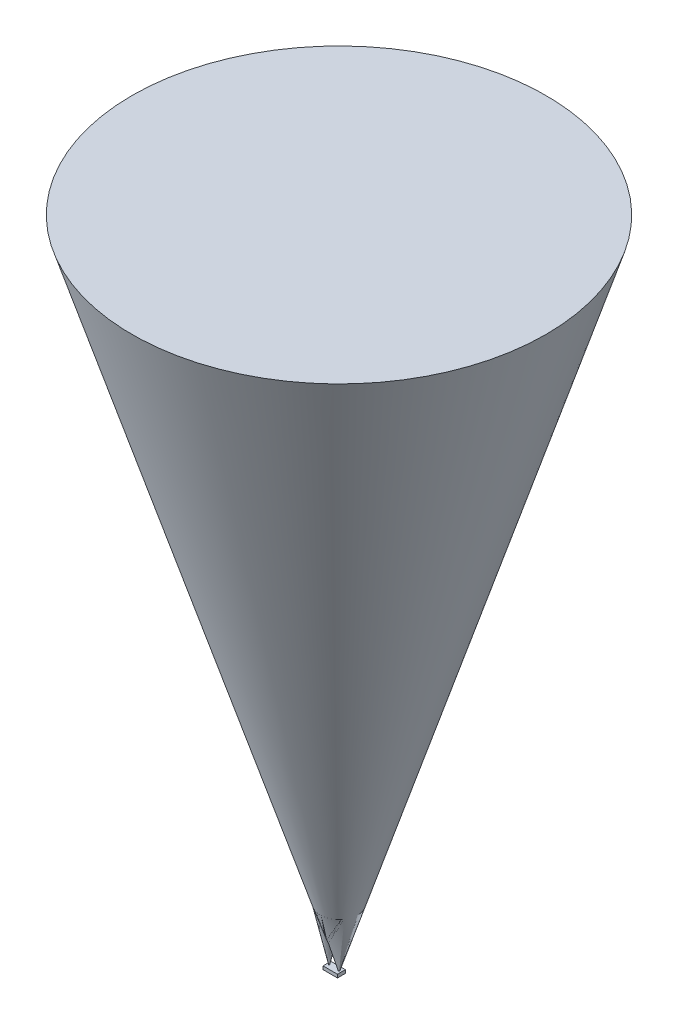
ISO-10303-21;
HEADER;
FILE_DESCRIPTION(('STEP AP214'),'2;1');
FILE_NAME('part.step','',(''),(''),'','','');
FILE_SCHEMA(('AUTOMOTIVE_DESIGN { 1 0 10303 214 1 1 1 1 }'));
ENDSEC;
DATA;
#1=APPLICATION_CONTEXT('core data for automotive mechanical design processes');
#2=APPLICATION_PROTOCOL_DEFINITION('international standard','automotive_design',2000,#1);
#3=PRODUCT_CONTEXT('',#1,'mechanical');
#4=PRODUCT('Part','Part','',(#3));
#5=PRODUCT_RELATED_PRODUCT_CATEGORY('part','',(#4));
#6=PRODUCT_DEFINITION_FORMATION('','',#4);
#7=PRODUCT_DEFINITION_CONTEXT('part definition',#1,'design');
#8=PRODUCT_DEFINITION('design','',#6,#7);
#9=PRODUCT_DEFINITION_SHAPE('','',#8);
#10=(LENGTH_UNIT() NAMED_UNIT(*) SI_UNIT(.MILLI.,.METRE.));
#11=(NAMED_UNIT(*) PLANE_ANGLE_UNIT() SI_UNIT($,.RADIAN.));
#12=(NAMED_UNIT(*) SI_UNIT($,.STERADIAN.) SOLID_ANGLE_UNIT());
#13=UNCERTAINTY_MEASURE_WITH_UNIT(LENGTH_MEASURE(1.E-05),#10,'distance_accuracy_value','');
#14=(GEOMETRIC_REPRESENTATION_CONTEXT(3) GLOBAL_UNCERTAINTY_ASSIGNED_CONTEXT((#13)) GLOBAL_UNIT_ASSIGNED_CONTEXT((#10,
#11,#12)) REPRESENTATION_CONTEXT('',''));
#15=CARTESIAN_POINT('',(0.,0.,0.));
#16=DIRECTION('',(0.,0.,1.));
#17=DIRECTION('',(1.,0.,0.));
#18=AXIS2_PLACEMENT_3D('',#15,#16,#17);
#19=CARTESIAN_POINT('',(-1.535,200.548929149634,0.));
#20=DIRECTION('',(0.,1.,0.));
#21=DIRECTION('',(0.,0.,1.));
#22=AXIS2_PLACEMENT_3D('',#19,#20,#21);
#23=PLANE('',#22);
#24=CARTESIAN_POINT('',(1.465,200.548929149634,0.));
#25=DIRECTION('',(0.,-1.,0.));
#26=DIRECTION('',(1.,0.,0.));
#27=AXIS2_PLACEMENT_3D('',#24,#25,#26);
#28=CIRCLE('',#27,63.117535682977);
#29=CARTESIAN_POINT('',(64.582535682977,200.548929149634,0.));
#30=VERTEX_POINT('',#29);
#31=EDGE_CURVE('E54',#30,#30,#28,.T.);
#32=ORIENTED_EDGE('',*,*,#31,.F.);
#33=EDGE_LOOP('',(#32));
#34=FACE_BOUND('',#33,.T.);
#35=ADVANCED_FACE('F43',(#34),#23,.T.);
#36=CARTESIAN_POINT('',(1.465,0.365681039527352,0.));
#37=DIRECTION('',(0.,1.,0.));
#38=DIRECTION('',(-1.,0.,0.));
#39=AXIS2_PLACEMENT_3D('',#36,#37,#38);
#40=CONICAL_SURFACE('',#39,0.,0.305432619099005);
#41=CARTESIAN_POINT('',(-8.50344210311053,31.9815402014116,0.));
#42=CARTESIAN_POINT('',(-8.50343353833006,31.981524732879,0.118857201583902));
#43=CARTESIAN_POINT('',(-8.49817121478473,31.9716507032928,0.237867029165868));
#44=CARTESIAN_POINT('',(-8.47768877357461,31.9331660366186,0.472012023839944));
#45=CARTESIAN_POINT('',(-8.46244752521837,31.9045156398503,0.587138422457629));
#46=CARTESIAN_POINT('',(-8.42367343589052,31.8314690826656,0.809553507505115));
#47=CARTESIAN_POINT('',(-8.40021309086815,31.7872105706222,0.916901125284098));
#48=CARTESIAN_POINT('',(-8.34670280067096,31.6859845009529,1.12351023837832));
#49=CARTESIAN_POINT('',(-8.31665214709803,31.6290155770621,1.22277086284113));
#50=CARTESIAN_POINT('',(-8.22742276674123,31.4593033314844,1.48344077889626));
#51=CARTESIAN_POINT('',(-8.1631406836987,31.3364751046561,1.63650882966374));
#52=CARTESIAN_POINT('',(-8.02538236323271,31.0714048718875,1.92012728675832));
#53=CARTESIAN_POINT('',(-7.95187483579721,30.9290966389491,2.05059728156288));
#54=CARTESIAN_POINT('',(-7.80568367047086,30.6439022803988,2.28230867641868));
#55=CARTESIAN_POINT('',(-7.73342206756682,30.5020104741413,2.38506625256794));
#56=CARTESIAN_POINT('',(-7.5860511964929,30.2104721029121,2.57673893351637));
#57=CARTESIAN_POINT('',(-7.51093949725936,30.0608188758322,2.66564187488177));
#58=CARTESIAN_POINT('',(-7.35896281818631,29.7556377825309,2.83164939420538));
#59=CARTESIAN_POINT('',(-7.2820950788074,29.6001003761228,2.90873369004084));
#60=CARTESIAN_POINT('',(-7.12753823712475,29.284795121319,3.05251018453797));
#61=CARTESIAN_POINT('',(-7.04984936323734,29.1250284317046,3.11920519597633));
#62=CARTESIAN_POINT('',(-6.88889611773646,28.7912102272249,3.2477393425061));
#63=CARTESIAN_POINT('',(-6.8056111692431,28.6169250973151,3.30894177067445));
#64=CARTESIAN_POINT('',(-6.6391699789398,28.2653422173134,3.4222706350648));
#65=CARTESIAN_POINT('',(-6.55601377001605,28.0880438033148,3.47439504194089));
#66=CARTESIAN_POINT('',(-6.39012710228885,27.7309125433886,3.57061098143731));
#67=CARTESIAN_POINT('',(-6.3073970418821,27.5510777649867,3.6146959880028));
#68=CARTESIAN_POINT('',(-6.14268293671001,27.1894368755594,3.69561695529915));
#69=CARTESIAN_POINT('',(-6.06069898264571,27.0076305305943,3.73245204562482));
#70=CARTESIAN_POINT('',(-5.81588458174825,26.4591173880919,3.83327283993961));
#71=CARTESIAN_POINT('',(-5.65448195300937,26.0899408213718,3.8874116764043));
#72=CARTESIAN_POINT('',(-5.33673464364037,25.347175031261,3.97380285265533));
#73=CARTESIAN_POINT('',(-5.18038805822051,24.9735875437678,4.00606352838827));
#74=CARTESIAN_POINT('',(-4.85930427599547,24.188574443757,4.05404420172993));
#75=CARTESIAN_POINT('',(-4.69511145239452,23.7768191567537,4.06797714935639));
#76=CARTESIAN_POINT('',(-4.37410525159036,22.9501882365656,4.07681079903725));
#77=CARTESIAN_POINT('',(-4.21729347773191,22.5353119479161,4.07170738507181));
#78=CARTESIAN_POINT('',(-3.91137003556743,21.7028269078403,4.04490795370185));
#79=CARTESIAN_POINT('',(-3.7622660421058,21.2852158822909,4.02319572572171));
#80=CARTESIAN_POINT('',(-3.47225218073109,20.4482245305874,3.96512784946486));
#81=CARTESIAN_POINT('',(-3.33134172439667,20.0288443338127,3.92877325422417));
#82=CARTESIAN_POINT('',(-3.05775983013202,19.1881373726247,3.84295051742471));
#83=CARTESIAN_POINT('',(-2.92509948698717,18.7668087720323,3.79346516900118));
#84=CARTESIAN_POINT('',(-2.66839912300766,17.9230758553103,3.68269211235594));
#85=CARTESIAN_POINT('',(-2.54435933488799,17.5006715104593,3.62140408568495));
#86=CARTESIAN_POINT('',(-2.30511894192223,16.655340662573,3.48809695125221));
#87=CARTESIAN_POINT('',(-2.18991307505369,16.232414625273,3.4160843081401));
#88=CARTESIAN_POINT('',(-1.96837849816342,15.3860807967842,3.26208367781385));
#89=CARTESIAN_POINT('',(-1.86204938294829,14.9626730284801,3.18009614633958));
#90=CARTESIAN_POINT('',(-1.64592789087336,14.0639554685839,2.99606426683372));
#91=CARTESIAN_POINT('',(-1.53729639989258,13.5886174638926,2.89279328785673));
#92=CARTESIAN_POINT('',(-1.33142424918579,12.6380938203264,2.67450197116632));
#93=CARTESIAN_POINT('',(-1.2341850028972,12.1629082076372,2.55948017883495));
#94=CARTESIAN_POINT('',(-1.09710917568128,11.4516087905772,2.37769262149852));
#95=CARTESIAN_POINT('',(-1.05294067476709,11.2151085198468,2.31565407532045));
#96=CARTESIAN_POINT('',(-0.967483610764037,10.742510240318,2.18816302633699));
#97=CARTESIAN_POINT('',(-0.92619497233033,10.5064122211534,2.12271061292579));
#98=CARTESIAN_POINT('',(-0.846529383132704,10.0349033002431,1.98795579367916));
#99=CARTESIAN_POINT('',(-0.808151542175948,9.79949220976763,1.91865457622457));
#100=CARTESIAN_POINT('',(-0.734323348216769,9.3296316666,1.7754158518257));
#101=CARTESIAN_POINT('',(-0.698872772772225,9.09518214212776,1.70147869791755));
#102=CARTESIAN_POINT('',(-0.643560029249029,8.71463279661656,1.57614152311155));
#103=CARTESIAN_POINT('',(-0.622798612895502,8.56806182970487,1.5265708739446));
#104=CARTESIAN_POINT('',(-0.582465507010859,8.27575873440817,1.4244315596009));
#105=CARTESIAN_POINT('',(-0.56289410848722,8.13002681903004,1.37186216715308));
#106=CARTESIAN_POINT('',(-0.524903783565857,7.83927229688415,1.26263023440985));
#107=CARTESIAN_POINT('',(-0.506489670913944,7.69425470333636,1.20595246998954));
#108=CARTESIAN_POINT('',(-0.479850476486562,7.47834422054129,1.11683144012364));
#109=CARTESIAN_POINT('',(-0.47113652673444,7.40666164309136,1.08644872466423));
#110=CARTESIAN_POINT('',(-0.454048693539378,7.26399873363279,1.02399140671901));
#111=CARTESIAN_POINT('',(-0.445674783908262,7.19301834786456,0.991916934962793));
#112=CARTESIAN_POINT('',(-0.429233773967533,7.05154453884788,0.925424980168036));
#113=CARTESIAN_POINT('',(-0.42116905868738,6.9810574054972,0.890993451952127));
#114=CARTESIAN_POINT('',(-0.405432224460889,6.84138809266155,0.819284668070515));
#115=CARTESIAN_POINT('',(-0.397760520406583,6.7722073390126,0.782004504532244));
#116=CARTESIAN_POINT('',(-0.382928245428266,6.63638339874704,0.703833967780044));
#117=CARTESIAN_POINT('',(-0.37576497327164,6.56972784312155,0.662965737498744));
#118=CARTESIAN_POINT('',(-0.362033594602776,6.44001236138564,0.575849983117886));
#119=CARTESIAN_POINT('',(-0.355464183317993,6.37694467134788,0.529614788240454));
#120=CARTESIAN_POINT('',(-0.345992194795261,6.28473818377523,0.451586571509095));
#121=CARTESIAN_POINT('',(-0.342776363473133,6.25316880548007,0.422735752685277));
#122=CARTESIAN_POINT('',(-0.336720163205177,6.19329059524265,0.361718317812212));
#123=CARTESIAN_POINT('',(-0.333879524084467,6.1649794189892,0.329554117756525));
#124=CARTESIAN_POINT('',(-0.329544371989592,6.12151573882393,0.271433483106739));
#125=CARTESIAN_POINT('',(-0.32790261353035,6.10497361460397,0.246543187391566));
#126=CARTESIAN_POINT('',(-0.325009811195627,6.07572923492793,0.194561612103664));
#127=CARTESIAN_POINT('',(-0.323757988625783,6.06301932825669,0.167474857013355));
#128=CARTESIAN_POINT('',(-0.322013593972999,6.04527261251962,0.117862893885106));
#129=CARTESIAN_POINT('',(-0.32141218448089,6.03913905216883,0.0957404514773157));
#130=CARTESIAN_POINT('',(-0.320582121659048,6.03066826521567,0.0507783211182011));
#131=CARTESIAN_POINT('',(-0.32035297521975,6.02832601655572,0.02793962290676));
#132=CARTESIAN_POINT('',(-0.320294456290532,6.02772813495327,-0.0178470009183164));
#133=CARTESIAN_POINT('',(-0.320466013143787,6.02948200204969,-0.04079505701761));
#134=CARTESIAN_POINT('',(-0.321189350192596,6.03686583585461,-0.0860561527654959));
#135=CARTESIAN_POINT('',(-0.321741587682683,6.0425004643401,-0.108368395034905));
#136=CARTESIAN_POINT('',(-0.323412064846398,6.05950440746355,-0.159271081934866));
#137=CARTESIAN_POINT('',(-0.324658904994565,6.07217213621447,-0.187416895521396));
#138=CARTESIAN_POINT('',(-0.327577726518336,6.1016969251448,-0.241376267587887));
#139=CARTESIAN_POINT('',(-0.329250774566816,6.11856449385617,-0.267183750937649));
#140=CARTESIAN_POINT('',(-0.334501344391531,6.17122645304376,-0.338425689043236));
#141=CARTESIAN_POINT('',(-0.338459031179428,6.21061251042342,-0.381142510117472));
#142=CARTESIAN_POINT('',(-0.344845384178019,6.2734528362766,-0.441034812753663));
#143=CARTESIAN_POINT('',(-0.347054289580778,6.2950762202825,-0.460338117049218));
#144=CARTESIAN_POINT('',(-0.351597931929152,6.33930913720092,-0.497763281514878));
#145=CARTESIAN_POINT('',(-0.353932607500758,6.36191818811324,-0.515885708564896));
#146=CARTESIAN_POINT('',(-0.36080298751735,6.42807228854551,-0.566636218931837));
#147=CARTESIAN_POINT('',(-0.365469808392576,6.47255414980813,-0.598015179758318));
#148=CARTESIAN_POINT('',(-0.375087401287954,6.56321763201109,-0.658184665813055));
#149=CARTESIAN_POINT('',(-0.380038356955568,6.60940034521112,-0.686973485355814));
#150=CARTESIAN_POINT('',(-0.395265120621311,6.74986703187012,-0.770485423440972));
#151=CARTESIAN_POINT('',(-0.405895319024663,6.84588094035275,-0.822219263491551));
#152=CARTESIAN_POINT('',(-0.427966042859005,7.04084634229693,-0.920817980969154));
#153=CARTESIAN_POINT('',(-0.439410522240789,7.13981059160998,-0.967655926736675));
#154=CARTESIAN_POINT('',(-0.462968339723053,7.33915976754081,-1.05760114004573));
#155=CARTESIAN_POINT('',(-0.475080686969109,7.43954243352835,-1.10071370296032));
#156=CARTESIAN_POINT('',(-0.499800775554357,7.64016902607989,-1.18371892682405));
#157=CARTESIAN_POINT('',(-0.512401069144961,7.74040085273109,-1.22364334071156));
#158=CARTESIAN_POINT('',(-0.538205059355485,7.94160118680548,-1.30139212531471));
#159=CARTESIAN_POINT('',(-0.551408788014724,8.04256973310498,-1.33921638428614));
#160=CARTESIAN_POINT('',(-0.591908047354339,8.3463328407776,-1.45016979740856));
#161=CARTESIAN_POINT('',(-0.620085725784913,8.54993670448628,-1.52076017790473));
#162=CARTESIAN_POINT('',(-0.678763922470137,8.95870270901807,-1.65719496220304));
#163=CARTESIAN_POINT('',(-0.709267680592872,9.16386665128435,-1.72303248823268));
#164=CARTESIAN_POINT('',(-0.772524895160625,9.57500244030837,-1.85088361098301));
#165=CARTESIAN_POINT('',(-0.805278039543231,9.7809741712764,-1.91289773587646));
#166=CARTESIAN_POINT('',(-0.872910834244302,10.1928410343326,-2.03356482013579));
#167=CARTESIAN_POINT('',(-0.907783602350886,10.3987344372028,-2.09222757156809));
#168=CARTESIAN_POINT('',(-0.979732194237152,10.8109103514159,-2.20678630291099));
#169=CARTESIAN_POINT('',(-1.01680808885575,11.0171928750638,-2.26268219375043));
#170=CARTESIAN_POINT('',(-1.13126844155806,11.6361430665674,-2.42653189690354));
#171=CARTESIAN_POINT('',(-1.21193323155565,12.0492037671871,-2.53073188495207));
#172=CARTESIAN_POINT('',(-1.40988175148611,13.0115999659157,-2.76287512506973));
#173=CARTESIAN_POINT('',(-1.53048539759487,13.5610887846422,-2.88736079790988));
#174=CARTESIAN_POINT('',(-1.78686018305597,14.6600201001591,-3.12062970558907));
#175=CARTESIAN_POINT('',(-1.92263541692268,15.209462544201,-3.22940868325441));
#176=CARTESIAN_POINT('',(-2.20927374247592,16.3080804928034,-3.43034280994533));
#177=CARTESIAN_POINT('',(-2.36015188522913,16.8572551718322,-3.52248111383839));
#178=CARTESIAN_POINT('',(-2.6765961536336,17.9540938706175,-3.68821145134101));
#179=CARTESIAN_POINT('',(-2.84216048921258,18.5017580661166,-3.76180574105717));
#180=CARTESIAN_POINT('',(-3.2187873416542,19.6934911398294,-3.89938723290372));
#181=CARTESIAN_POINT('',(-3.43267482176797,20.3371655063845,-3.95925961706947));
#182=CARTESIAN_POINT('',(-3.76793116726182,21.2995291458976,-4.02300842088785));
#183=CARTESIAN_POINT('',(-3.88212785856449,21.6198984168988,-4.03991601085244));
#184=CARTESIAN_POINT('',(-4.11517122632781,22.259296910097,-4.06412340088298));
#185=CARTESIAN_POINT('',(-4.23401754060321,22.5783262345347,-4.07142394776715));
#186=CARTESIAN_POINT('',(-4.47635613459347,23.215212860776,-4.07537793353337));
#187=CARTESIAN_POINT('',(-4.59985480378618,23.5330678396348,-4.07201615992647));
#188=CARTESIAN_POINT('',(-4.8510855394427,24.1667221403735,-4.05334022802523));
#189=CARTESIAN_POINT('',(-4.97881710481663,24.4825217003157,-4.0380274796807));
#190=CARTESIAN_POINT('',(-5.23808518397982,25.1112816876259,-3.99391321623101));
#191=CARTESIAN_POINT('',(-5.36961801033279,25.424244503584,-3.96512438714992));
#192=CARTESIAN_POINT('',(-5.63613623720672,26.0468433649599,-3.89212244463673));
#193=CARTESIAN_POINT('',(-5.77112087416214,26.3564801249694,-3.84791271553172));
#194=CARTESIAN_POINT('',(-6.04482665710741,26.9734516304103,-3.74121688686923));
#195=CARTESIAN_POINT('',(-6.18356650212447,27.2807579614871,-3.67861282920847));
#196=CARTESIAN_POINT('',(-6.4631032474745,27.8896839265888,-3.53179815497081));
#197=CARTESIAN_POINT('',(-6.60390165091802,28.1912989948535,-3.44757092169483));
#198=CARTESIAN_POINT('',(-6.81495024351373,28.6363663230003,-3.3017782594615));
#199=CARTESIAN_POINT('',(-6.88509460309366,28.7831278786769,-3.25009652282936));
#200=CARTESIAN_POINT('',(-7.02515935925059,29.073976477114,-3.13945491481379));
#201=CARTESIAN_POINT('',(-7.09507979716879,29.2180640402945,-3.08049647709972));
#202=CARTESIAN_POINT('',(-7.23421715884772,29.5027102155796,-2.9544858020431));
#203=CARTESIAN_POINT('',(-7.30343498794757,29.6432738433211,-2.88744596210174));
#204=CARTESIAN_POINT('',(-7.44072535703417,29.9201430052362,-2.74411879087686));
#205=CARTESIAN_POINT('',(-7.50879839152579,30.0564504009273,-2.66783557561994));
#206=CARTESIAN_POINT('',(-7.6263776438804,30.2903432977215,-2.52494131059227));
#207=CARTESIAN_POINT('',(-7.67629286648784,30.389131646105,-2.46063958190103));
#208=CARTESIAN_POINT('',(-7.77463873434064,30.5828530870703,-2.32534159541217));
#209=CARTESIAN_POINT('',(-7.82306909416818,30.6777854395841,-2.25434406111637));
#210=CARTESIAN_POINT('',(-7.91773717372759,30.8625291272209,-2.10507141775448));
#211=CARTESIAN_POINT('',(-7.96397975180133,30.9523519084652,-2.02681369890541));
#212=CARTESIAN_POINT('',(-8.05356420804039,31.1256521621167,-1.86211059945328));
#213=CARTESIAN_POINT('',(-8.09690801876043,31.209133867146,-1.77567076847261));
#214=CARTESIAN_POINT('',(-8.18560076935105,31.3793321018729,-1.5806728673408));
#215=CARTESIAN_POINT('',(-8.2303448936994,31.4647937429007,-1.47072082175922));
#216=CARTESIAN_POINT('',(-8.31242605926362,31.6210274432726,-1.23815624848824));
#217=CARTESIAN_POINT('',(-8.3497687137087,31.6918106365601,-1.11555342321095));
#218=CARTESIAN_POINT('',(-8.40838951945194,31.8026490616914,-0.881089555020864));
#219=CARTESIAN_POINT('',(-8.43134322691188,31.8459296580514,-0.77119203005407));
#220=CARTESIAN_POINT('',(-8.46840772723403,31.915727037745,-0.544875433731823));
#221=CARTESIAN_POINT('',(-8.48254244731084,31.9422891824447,-0.428474950234487));
#222=CARTESIAN_POINT('',(-8.49551030209468,31.9666482657392,-0.259128097837425));
#223=CARTESIAN_POINT('',(-8.49847636076274,31.9722176565581,-0.207519864795321));
#224=CARTESIAN_POINT('',(-8.50244437975405,31.9796674682037,-0.103950878487534));
#225=CARTESIAN_POINT('',(-8.50344584948246,31.9815469675951,-0.0519900404195587));
#226=CARTESIAN_POINT('',(-8.50344210311053,31.9815402014116,0.));
#227=B_SPLINE_CURVE_WITH_KNOTS('',3,(#41,#42,#43,#44,#45,#46,#47,#48,#49,#50,#51,#52,#53,#54,
#55,#56,#57,#58,#59,#60,#61,#62,#63,#64,#65,#66,#67,#68,#69,#70,#71,#72,#73,#74,#75,#76,#77,#78,
#79,#80,#81,#82,#83,#84,#85,#86,#87,#88,#89,#90,#91,#92,#93,#94,#95,#96,#97,#98,#99,#100,#101,
#102,#103,#104,#105,#106,#107,#108,#109,#110,#111,#112,#113,#114,#115,#116,#117,#118,#119,#120,
#121,#122,#123,#124,#125,#126,#127,#128,#129,#130,#131,#132,#133,#134,#135,#136,#137,#138,#139,
#140,#141,#142,#143,#144,#145,#146,#147,#148,#149,#150,#151,#152,#153,#154,#155,#156,#157,#158,
#159,#160,#161,#162,#163,#164,#165,#166,#167,#168,#169,#170,#171,#172,#173,#174,#175,#176,#177,
#178,#179,#180,#181,#182,#183,#184,#185,#186,#187,#188,#189,#190,#191,#192,#193,#194,#195,#196,
#197,#198,#199,#200,#201,#202,#203,#204,#205,#206,#207,#208,#209,#210,#211,#212,#213,#214,#215,
#216,#217,#218,#219,#220,#221,#222,#223,#224,#225,#226),.UNSPECIFIED.,.T.,.F.,(4,2,2,2,2,2,2,2,
2,2,2,2,2,2,2,2,2,2,2,2,2,2,2,2,2,2,2,2,2,2,2,2,2,2,2,2,2,2,2,2,2,2,2,2,2,2,2,2,2,2,2,2,2,2,2,2,
2,2,2,2,2,2,2,2,2,2,2,2,2,2,2,2,2,2,2,2,2,2,2,2,2,2,2,2,2,2,2,2,2,2,2,2,4),(0.,
0.356344864535423,0.713446751791247,1.0674750158012,1.42154135329248,2.03751705981661,
2.65564149150793,3.22333747748491,3.79152908803982,4.36068512057437,4.92968679197432,
5.53730328915186,6.14505544207583,6.75329876822524,7.36161507392736,8.58036536321025,
9.79865102688,11.1285988712475,12.4588342920502,13.7903697117104,15.1218093883506,
16.4550025077239,17.788231603159,19.1206602752975,20.4530280933228,21.9479922641822,
23.443141719471,24.1884876037262,24.9338139804339,25.6789114912968,26.4239523301939,
26.8922637732411,27.3606892805705,27.8309493346393,28.0659582629103,28.3009490575179,
28.5374881558945,28.7742720235204,29.0096854963558,29.2445684884602,29.3730783365813,
29.5014951346367,29.5910584622014,29.6804417695957,29.7490532867936,29.8175738450217,
29.8862534793665,29.9550157595658,30.0471566324006,30.1395304118733,30.3132076310185,
30.400415848805,30.4875818890992,30.6513541396355,30.815233461556,31.1436873270032,
31.4738621576677,31.8035596706394,32.1294024414654,32.4552625330221,33.1071394211832,
33.7599414667649,34.4126531298883,35.0633483124433,35.7140644286622,37.0145788074971,
38.7426837863405,40.4712562784615,42.2015688919478,43.9316708899458,45.9732433478364,
46.9947093609578,48.0160959641619,49.0389404881254,50.0616643573716,51.0834273917852,
52.1049663272875,53.1332046888695,54.1622355954798,54.674122926211,55.1859095644517,
55.696920847676,56.2077054107551,56.5915203351664,56.9754085790986,57.3583999402142,
57.7411333689178,58.1787892269019,58.6161118885653,58.9757107563089,59.3343296875235,
59.4901617197448,59.6460326612075),.UNSPECIFIED.);
#228=CARTESIAN_POINT('',(-8.50344210311053,31.9815402014116,0.));
#229=VERTEX_POINT('',#228);
#230=EDGE_CURVE('E12',#229,#229,#227,.T.);
#231=ORIENTED_EDGE('',*,*,#230,.T.);
#232=EDGE_LOOP('',(#231));
#233=FACE_BOUND('',#232,.T.);
#234=ORIENTED_EDGE('',*,*,#31,.T.);
#235=EDGE_LOOP('',(#234));
#236=FACE_BOUND('',#235,.T.);
#237=CARTESIAN_POINT('',(1.465,0.365681039527352,0.));
#238=VERTEX_POINT('',#237);
#239=VERTEX_LOOP('',#238);
#240=FACE_BOUND('',#239,.T.);
#241=ADVANCED_FACE('F60',(#233,#236,#240),#40,.T.);
#242=CARTESIAN_POINT('',(-1.535,0.548929149633788,0.));
#243=DIRECTION('',(0.,1.,0.));
#244=DIRECTION('',(0.,0.,1.));
#245=AXIS2_PLACEMENT_3D('',#242,#243,#244);
#246=CONICAL_SURFACE('',#245,0.,0.218166156499288);
#247=ORIENTED_EDGE('',*,*,#230,.F.);
#248=EDGE_LOOP('',(#247));
#249=FACE_BOUND('',#248,.T.);
#250=CARTESIAN_POINT('',(-1.535,0.548929149633788,0.));
#251=VERTEX_POINT('',#250);
#252=VERTEX_LOOP('',#251);
#253=FACE_BOUND('',#252,.T.);
#254=ADVANCED_FACE('F62',(#249,#253),#246,.T.);
#255=CLOSED_SHELL('',(#35,#241,#254));
#256=MANIFOLD_SOLID_BREP('B2',#255);
#257=CARTESIAN_POINT('',(0.,1.,0.));
#258=DIRECTION('',(0.,-1.,0.));
#259=DIRECTION('',(0.,0.,-1.));
#260=AXIS2_PLACEMENT_3D('',#257,#258,#259);
#261=PLANE('',#260);
#262=DIRECTION('',(0.,0.,-1.));
#263=VECTOR('',#262,1.);
#264=CARTESIAN_POINT('',(2.2,1.,1.2));
#265=LINE('',#264,#263);
#266=CARTESIAN_POINT('',(2.2,1.,1.2));
#267=VERTEX_POINT('',#266);
#268=CARTESIAN_POINT('',(2.2,1.,-1.2));
#269=VERTEX_POINT('',#268);
#270=EDGE_CURVE('E150',#267,#269,#265,.T.);
#271=ORIENTED_EDGE('',*,*,#270,.T.);
#272=DIRECTION('',(-1.,0.,0.));
#273=VECTOR('',#272,1.);
#274=CARTESIAN_POINT('',(-2.2,1.,-1.2));
#275=LINE('',#274,#273);
#276=CARTESIAN_POINT('',(-2.2,1.,-1.2));
#277=VERTEX_POINT('',#276);
#278=EDGE_CURVE('E145',#269,#277,#275,.T.);
#279=ORIENTED_EDGE('',*,*,#278,.T.);
#280=DIRECTION('',(0.,0.,1.));
#281=VECTOR('',#280,1.);
#282=CARTESIAN_POINT('',(-2.2,1.,1.2));
#283=LINE('',#282,#281);
#284=CARTESIAN_POINT('',(-2.2,1.,1.2));
#285=VERTEX_POINT('',#284);
#286=EDGE_CURVE('E148',#277,#285,#283,.T.);
#287=ORIENTED_EDGE('',*,*,#286,.T.);
#288=DIRECTION('',(1.,0.,0.));
#289=VECTOR('',#288,1.);
#290=CARTESIAN_POINT('',(-2.2,1.,1.2));
#291=LINE('',#290,#289);
#292=EDGE_CURVE('E115',#285,#267,#291,.T.);
#293=ORIENTED_EDGE('',*,*,#292,.T.);
#294=EDGE_LOOP('',(#271,#279,#287,#293));
#295=FACE_BOUND('',#294,.T.);
#296=CARTESIAN_POINT('',(1.465,1.,0.));
#297=DIRECTION('',(0.,1.,0.));
#298=DIRECTION('',(0.,0.,1.));
#299=AXIS2_PLACEMENT_3D('',#296,#297,#298);
#300=CIRCLE('',#299,0.2);
#301=CARTESIAN_POINT('',(1.465,1.,0.2));
#302=VERTEX_POINT('',#301);
#303=EDGE_CURVE('E165',#302,#302,#300,.T.);
#304=ORIENTED_EDGE('',*,*,#303,.F.);
#305=EDGE_LOOP('',(#304));
#306=FACE_BOUND('',#305,.T.);
#307=CARTESIAN_POINT('',(-1.535,1.,0.));
#308=DIRECTION('',(0.,1.,0.));
#309=DIRECTION('',(0.,0.,1.));
#310=AXIS2_PLACEMENT_3D('',#307,#308,#309);
#311=CIRCLE('',#310,0.1);
#312=CARTESIAN_POINT('',(-1.535,1.,0.1));
#313=VERTEX_POINT('',#312);
#314=EDGE_CURVE('E180',#313,#313,#311,.T.);
#315=ORIENTED_EDGE('',*,*,#314,.F.);
#316=EDGE_LOOP('',(#315));
#317=FACE_BOUND('',#316,.T.);
#318=ADVANCED_FACE('F98',(#295,#306,#317),#261,.F.);
#319=CARTESIAN_POINT('',(0.,0.,0.));
#320=DIRECTION('',(0.,-1.,0.));
#321=DIRECTION('',(0.,0.,-1.));
#322=AXIS2_PLACEMENT_3D('',#319,#320,#321);
#323=PLANE('',#322);
#324=CARTESIAN_POINT('',(1.465,0.,0.));
#325=DIRECTION('',(0.,1.,0.));
#326=DIRECTION('',(0.,0.,1.));
#327=AXIS2_PLACEMENT_3D('',#324,#325,#326);
#328=CIRCLE('',#327,0.2);
#329=CARTESIAN_POINT('',(1.465,0.,0.2));
#330=VERTEX_POINT('',#329);
#331=EDGE_CURVE('E177',#330,#330,#328,.T.);
#332=ORIENTED_EDGE('',*,*,#331,.T.);
#333=EDGE_LOOP('',(#332));
#334=FACE_BOUND('',#333,.T.);
#335=DIRECTION('',(0.,0.,-1.));
#336=VECTOR('',#335,1.);
#337=CARTESIAN_POINT('',(2.2,0.,1.2));
#338=LINE('',#337,#336);
#339=CARTESIAN_POINT('',(2.2,0.,1.2));
#340=VERTEX_POINT('',#339);
#341=CARTESIAN_POINT('',(2.2,0.,-1.2));
#342=VERTEX_POINT('',#341);
#343=EDGE_CURVE('E162',#340,#342,#338,.T.);
#344=ORIENTED_EDGE('',*,*,#343,.F.);
#345=DIRECTION('',(1.,0.,0.));
#346=VECTOR('',#345,1.);
#347=CARTESIAN_POINT('',(-2.2,0.,1.2));
#348=LINE('',#347,#346);
#349=CARTESIAN_POINT('',(-2.2,0.,1.2));
#350=VERTEX_POINT('',#349);
#351=EDGE_CURVE('E138',#350,#340,#348,.T.);
#352=ORIENTED_EDGE('',*,*,#351,.F.);
#353=DIRECTION('',(0.,0.,1.));
#354=VECTOR('',#353,1.);
#355=CARTESIAN_POINT('',(-2.2,0.,1.2));
#356=LINE('',#355,#354);
#357=CARTESIAN_POINT('',(-2.2,0.,-1.2));
#358=VERTEX_POINT('',#357);
#359=EDGE_CURVE('E132',#358,#350,#356,.T.);
#360=ORIENTED_EDGE('',*,*,#359,.F.);
#361=DIRECTION('',(-1.,0.,0.));
#362=VECTOR('',#361,1.);
#363=CARTESIAN_POINT('',(-2.2,0.,-1.2));
#364=LINE('',#363,#362);
#365=EDGE_CURVE('E154',#342,#358,#364,.T.);
#366=ORIENTED_EDGE('',*,*,#365,.F.);
#367=EDGE_LOOP('',(#344,#352,#360,#366));
#368=FACE_BOUND('',#367,.T.);
#369=CARTESIAN_POINT('',(-1.535,0.,0.));
#370=DIRECTION('',(0.,1.,0.));
#371=DIRECTION('',(0.,0.,1.));
#372=AXIS2_PLACEMENT_3D('',#369,#370,#371);
#373=CIRCLE('',#372,0.1);
#374=CARTESIAN_POINT('',(-1.535,0.,0.1));
#375=VERTEX_POINT('',#374);
#376=EDGE_CURVE('E183',#375,#375,#373,.T.);
#377=ORIENTED_EDGE('',*,*,#376,.T.);
#378=EDGE_LOOP('',(#377));
#379=FACE_BOUND('',#378,.T.);
#380=ADVANCED_FACE('F173',(#334,#368,#379),#323,.T.);
#381=CARTESIAN_POINT('',(2.2,1.,1.2));
#382=DIRECTION('',(-1.,0.,0.));
#383=DIRECTION('',(0.,0.,1.));
#384=AXIS2_PLACEMENT_3D('',#381,#382,#383);
#385=PLANE('',#384);
#386=ORIENTED_EDGE('',*,*,#343,.T.);
#387=DIRECTION('',(0.,-1.,0.));
#388=VECTOR('',#387,1.);
#389=CARTESIAN_POINT('',(2.2,1.,-1.2));
#390=LINE('',#389,#388);
#391=EDGE_CURVE('E41',#269,#342,#390,.T.);
#392=ORIENTED_EDGE('',*,*,#391,.F.);
#393=ORIENTED_EDGE('',*,*,#270,.F.);
#394=DIRECTION('',(0.,-1.,0.));
#395=VECTOR('',#394,1.);
#396=CARTESIAN_POINT('',(2.2,1.,1.2));
#397=LINE('',#396,#395);
#398=EDGE_CURVE('E158',#267,#340,#397,.T.);
#399=ORIENTED_EDGE('',*,*,#398,.T.);
#400=EDGE_LOOP('',(#386,#392,#393,#399));
#401=FACE_BOUND('',#400,.T.);
#402=ADVANCED_FACE('F100',(#401),#385,.F.);
#403=CARTESIAN_POINT('',(-2.2,1.,-1.2));
#404=DIRECTION('',(0.,0.,1.));
#405=DIRECTION('',(1.,0.,0.));
#406=AXIS2_PLACEMENT_3D('',#403,#404,#405);
#407=PLANE('',#406);
#408=ORIENTED_EDGE('',*,*,#365,.T.);
#409=DIRECTION('',(0.,-1.,0.));
#410=VECTOR('',#409,1.);
#411=CARTESIAN_POINT('',(-2.2,1.,-1.2));
#412=LINE('',#411,#410);
#413=EDGE_CURVE('E107',#277,#358,#412,.T.);
#414=ORIENTED_EDGE('',*,*,#413,.F.);
#415=ORIENTED_EDGE('',*,*,#278,.F.);
#416=ORIENTED_EDGE('',*,*,#391,.T.);
#417=EDGE_LOOP('',(#408,#414,#415,#416));
#418=FACE_BOUND('',#417,.T.);
#419=ADVANCED_FACE('F153',(#418),#407,.F.);
#420=CARTESIAN_POINT('',(-2.2,1.,1.2));
#421=DIRECTION('',(1.,0.,0.));
#422=DIRECTION('',(0.,0.,-1.));
#423=AXIS2_PLACEMENT_3D('',#420,#421,#422);
#424=PLANE('',#423);
#425=ORIENTED_EDGE('',*,*,#359,.T.);
#426=DIRECTION('',(0.,-1.,0.));
#427=VECTOR('',#426,1.);
#428=CARTESIAN_POINT('',(-2.2,1.,1.2));
#429=LINE('',#428,#427);
#430=EDGE_CURVE('E155',#285,#350,#429,.T.);
#431=ORIENTED_EDGE('',*,*,#430,.F.);
#432=ORIENTED_EDGE('',*,*,#286,.F.);
#433=ORIENTED_EDGE('',*,*,#413,.T.);
#434=EDGE_LOOP('',(#425,#431,#432,#433));
#435=FACE_BOUND('',#434,.T.);
#436=ADVANCED_FACE('F156',(#435),#424,.F.);
#437=CARTESIAN_POINT('',(-2.2,1.,1.2));
#438=DIRECTION('',(0.,0.,-1.));
#439=DIRECTION('',(-1.,0.,0.));
#440=AXIS2_PLACEMENT_3D('',#437,#438,#439);
#441=PLANE('',#440);
#442=ORIENTED_EDGE('',*,*,#351,.T.);
#443=ORIENTED_EDGE('',*,*,#398,.F.);
#444=ORIENTED_EDGE('',*,*,#292,.F.);
#445=ORIENTED_EDGE('',*,*,#430,.T.);
#446=EDGE_LOOP('',(#442,#443,#444,#445));
#447=FACE_BOUND('',#446,.T.);
#448=ADVANCED_FACE('F170',(#447),#441,.F.);
#449=CARTESIAN_POINT('',(1.465,1.,0.));
#450=DIRECTION('',(0.,-1.,0.));
#451=DIRECTION('',(0.,0.,-1.));
#452=AXIS2_PLACEMENT_3D('',#449,#450,#451);
#453=CYLINDRICAL_SURFACE('',#452,0.2);
#454=ORIENTED_EDGE('',*,*,#303,.T.);
#455=EDGE_LOOP('',(#454));
#456=FACE_BOUND('',#455,.T.);
#457=ORIENTED_EDGE('',*,*,#331,.F.);
#458=EDGE_LOOP('',(#457));
#459=FACE_BOUND('',#458,.T.);
#460=ADVANCED_FACE('F200',(#456,#459),#453,.F.);
#461=CARTESIAN_POINT('',(-1.535,1.,0.));
#462=DIRECTION('',(0.,-1.,0.));
#463=DIRECTION('',(0.,0.,-1.));
#464=AXIS2_PLACEMENT_3D('',#461,#462,#463);
#465=CYLINDRICAL_SURFACE('',#464,0.1);
#466=ORIENTED_EDGE('',*,*,#314,.T.);
#467=EDGE_LOOP('',(#466));
#468=FACE_BOUND('',#467,.T.);
#469=ORIENTED_EDGE('',*,*,#376,.F.);
#470=EDGE_LOOP('',(#469));
#471=FACE_BOUND('',#470,.T.);
#472=ADVANCED_FACE('F189',(#468,#471),#465,.F.);
#473=CLOSED_SHELL('',(#318,#380,#402,#419,#436,#448,#460,#472));
#474=MANIFOLD_SOLID_BREP('B6',#473);
#475=ADVANCED_BREP_SHAPE_REPRESENTATION('',(#18,#256,#474),#14);
#476=SHAPE_DEFINITION_REPRESENTATION(#9,#475);
ENDSEC;
END-ISO-10303-21;
